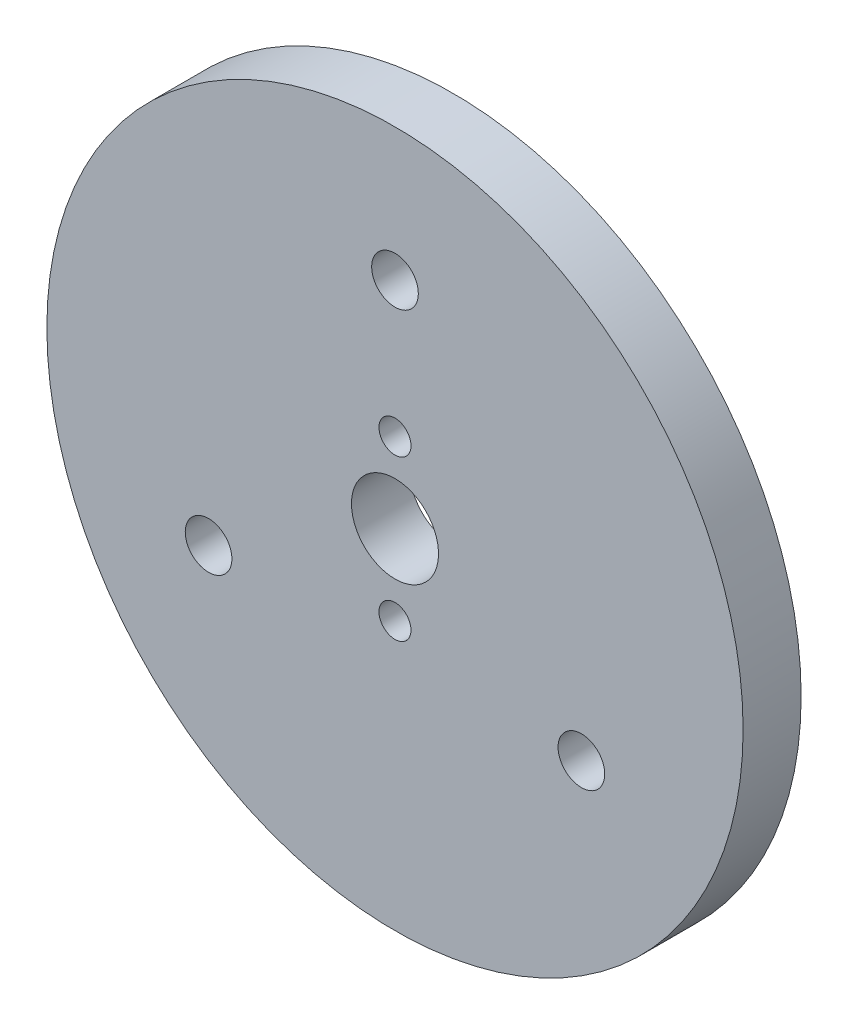
ISO-10303-21;
HEADER;
FILE_DESCRIPTION(('STEP AP214'),'2;1');
FILE_NAME('part.step','',(''),(''),'','','');
FILE_SCHEMA(('AUTOMOTIVE_DESIGN { 1 0 10303 214 1 1 1 1 }'));
ENDSEC;
DATA;
#1=APPLICATION_CONTEXT('core data for automotive mechanical design processes');
#2=APPLICATION_PROTOCOL_DEFINITION('international standard','automotive_design',2000,#1);
#3=PRODUCT_CONTEXT('',#1,'mechanical');
#4=PRODUCT('Part','Part','',(#3));
#5=PRODUCT_RELATED_PRODUCT_CATEGORY('part','',(#4));
#6=PRODUCT_DEFINITION_FORMATION('','',#4);
#7=PRODUCT_DEFINITION_CONTEXT('part definition',#1,'design');
#8=PRODUCT_DEFINITION('design','',#6,#7);
#9=PRODUCT_DEFINITION_SHAPE('','',#8);
#10=(LENGTH_UNIT() NAMED_UNIT(*) SI_UNIT(.MILLI.,.METRE.));
#11=(NAMED_UNIT(*) PLANE_ANGLE_UNIT() SI_UNIT($,.RADIAN.));
#12=(NAMED_UNIT(*) SI_UNIT($,.STERADIAN.) SOLID_ANGLE_UNIT());
#13=UNCERTAINTY_MEASURE_WITH_UNIT(LENGTH_MEASURE(1.E-05),#10,'distance_accuracy_value','');
#14=(GEOMETRIC_REPRESENTATION_CONTEXT(3) GLOBAL_UNCERTAINTY_ASSIGNED_CONTEXT((#13)) GLOBAL_UNIT_ASSIGNED_CONTEXT((#10,
#11,#12)) REPRESENTATION_CONTEXT('',''));
#15=CARTESIAN_POINT('',(0.,0.,0.));
#16=DIRECTION('',(0.,0.,1.));
#17=DIRECTION('',(1.,0.,0.));
#18=AXIS2_PLACEMENT_3D('',#15,#16,#17);
#19=CARTESIAN_POINT('',(0.,0.,0.));
#20=DIRECTION('',(0.,0.,1.));
#21=DIRECTION('',(1.,0.,0.));
#22=AXIS2_PLACEMENT_3D('',#19,#20,#21);
#23=PLANE('',#22);
#24=CARTESIAN_POINT('',(0.,23.5585,0.));
#25=DIRECTION('',(0.,0.,-1.));
#26=DIRECTION('',(-1.,0.,0.));
#27=AXIS2_PLACEMENT_3D('',#24,#25,#26);
#28=CIRCLE('',#27,2.5527);
#29=CARTESIAN_POINT('',(-2.5527,23.5585,0.));
#30=VERTEX_POINT('',#29);
#31=EDGE_CURVE('E78',#30,#30,#28,.T.);
#32=ORIENTED_EDGE('',*,*,#31,.F.);
#33=EDGE_LOOP('',(#32));
#34=FACE_BOUND('',#33,.T.);
#35=CARTESIAN_POINT('',(20.4022594750558,-11.7792499999998,0.));
#36=DIRECTION('',(0.,0.,-1.));
#37=DIRECTION('',(-1.,0.,0.));
#38=AXIS2_PLACEMENT_3D('',#35,#36,#37);
#39=CIRCLE('',#38,2.5527);
#40=CARTESIAN_POINT('',(17.8495594750558,-11.7792499999998,0.));
#41=VERTEX_POINT('',#40);
#42=EDGE_CURVE('E72',#41,#41,#39,.T.);
#43=ORIENTED_EDGE('',*,*,#42,.F.);
#44=EDGE_LOOP('',(#43));
#45=FACE_BOUND('',#44,.T.);
#46=CARTESIAN_POINT('',(0.,0.,0.));
#47=DIRECTION('',(0.,0.,1.));
#48=DIRECTION('',(1.,0.,0.));
#49=AXIS2_PLACEMENT_3D('',#46,#47,#48);
#50=CIRCLE('',#49,38.1);
#51=CARTESIAN_POINT('',(38.1,0.,0.));
#52=VERTEX_POINT('',#51);
#53=EDGE_CURVE('E37',#52,#52,#50,.T.);
#54=ORIENTED_EDGE('',*,*,#53,.F.);
#55=EDGE_LOOP('',(#54));
#56=FACE_BOUND('',#55,.T.);
#57=CARTESIAN_POINT('',(0.,0.,0.));
#58=DIRECTION('',(0.,0.,-1.));
#59=DIRECTION('',(-1.,0.,0.));
#60=AXIS2_PLACEMENT_3D('',#57,#58,#59);
#61=CIRCLE('',#60,4.7625);
#62=CARTESIAN_POINT('',(-4.7625,0.,0.));
#63=VERTEX_POINT('',#62);
#64=EDGE_CURVE('E46',#63,#63,#61,.T.);
#65=ORIENTED_EDGE('',*,*,#64,.F.);
#66=EDGE_LOOP('',(#65));
#67=FACE_BOUND('',#66,.T.);
#68=CARTESIAN_POINT('',(0.,8.7376,0.));
#69=DIRECTION('',(0.,0.,-1.));
#70=DIRECTION('',(-1.,0.,0.));
#71=AXIS2_PLACEMENT_3D('',#68,#69,#70);
#72=CIRCLE('',#71,1.7526);
#73=CARTESIAN_POINT('',(-1.7526,8.7376,0.));
#74=VERTEX_POINT('',#73);
#75=EDGE_CURVE('E52',#74,#74,#72,.T.);
#76=ORIENTED_EDGE('',*,*,#75,.F.);
#77=EDGE_LOOP('',(#76));
#78=FACE_BOUND('',#77,.T.);
#79=CARTESIAN_POINT('',(0.,-8.7376,0.));
#80=DIRECTION('',(0.,0.,-1.));
#81=DIRECTION('',(1.,0.,0.));
#82=AXIS2_PLACEMENT_3D('',#79,#80,#81);
#83=CIRCLE('',#82,1.7526);
#84=CARTESIAN_POINT('',(1.7526,-8.7376,0.));
#85=VERTEX_POINT('',#84);
#86=EDGE_CURVE('E58',#85,#85,#83,.T.);
#87=ORIENTED_EDGE('',*,*,#86,.F.);
#88=EDGE_LOOP('',(#87));
#89=FACE_BOUND('',#88,.T.);
#90=CARTESIAN_POINT('',(-20.4022594750556,-11.7792500000001,0.));
#91=DIRECTION('',(0.,0.,-1.));
#92=DIRECTION('',(-1.,0.,0.));
#93=AXIS2_PLACEMENT_3D('',#90,#91,#92);
#94=CIRCLE('',#93,2.5527);
#95=CARTESIAN_POINT('',(-22.9549594750556,-11.7792500000001,0.));
#96=VERTEX_POINT('',#95);
#97=EDGE_CURVE('E66',#96,#96,#94,.T.);
#98=ORIENTED_EDGE('',*,*,#97,.F.);
#99=EDGE_LOOP('',(#98));
#100=FACE_BOUND('',#99,.T.);
#101=ADVANCED_FACE('F33',(#34,#45,#56,#67,#78,#89,#100),#23,.F.);
#102=CARTESIAN_POINT('',(0.,0.,6.35));
#103=DIRECTION('',(0.,0.,-1.));
#104=DIRECTION('',(-1.,0.,0.));
#105=AXIS2_PLACEMENT_3D('',#102,#103,#104);
#106=CYLINDRICAL_SURFACE('',#105,38.1);
#107=CARTESIAN_POINT('',(0.,0.,6.35));
#108=DIRECTION('',(0.,0.,1.));
#109=DIRECTION('',(1.,0.,0.));
#110=AXIS2_PLACEMENT_3D('',#107,#108,#109);
#111=CIRCLE('',#110,38.1);
#112=CARTESIAN_POINT('',(38.1,0.,6.35));
#113=VERTEX_POINT('',#112);
#114=EDGE_CURVE('E10',#113,#113,#111,.T.);
#115=ORIENTED_EDGE('',*,*,#114,.F.);
#116=EDGE_LOOP('',(#115));
#117=FACE_BOUND('',#116,.T.);
#118=ORIENTED_EDGE('',*,*,#53,.T.);
#119=EDGE_LOOP('',(#118));
#120=FACE_BOUND('',#119,.T.);
#121=ADVANCED_FACE('F35',(#117,#120),#106,.T.);
#122=CARTESIAN_POINT('',(0.,0.,6.35));
#123=DIRECTION('',(0.,0.,1.));
#124=DIRECTION('',(1.,0.,0.));
#125=AXIS2_PLACEMENT_3D('',#122,#123,#124);
#126=PLANE('',#125);
#127=CARTESIAN_POINT('',(0.,23.5585,6.35));
#128=DIRECTION('',(0.,0.,1.));
#129=DIRECTION('',(1.,0.,0.));
#130=AXIS2_PLACEMENT_3D('',#127,#128,#129);
#131=CIRCLE('',#130,2.5527);
#132=CARTESIAN_POINT('',(2.5527,23.5585,6.35));
#133=VERTEX_POINT('',#132);
#134=EDGE_CURVE('E75',#133,#133,#131,.T.);
#135=ORIENTED_EDGE('',*,*,#134,.F.);
#136=EDGE_LOOP('',(#135));
#137=FACE_BOUND('',#136,.T.);
#138=CARTESIAN_POINT('',(20.4022594750558,-11.7792499999998,6.35));
#139=DIRECTION('',(0.,0.,1.));
#140=DIRECTION('',(1.,0.,0.));
#141=AXIS2_PLACEMENT_3D('',#138,#139,#140);
#142=CIRCLE('',#141,2.5527);
#143=CARTESIAN_POINT('',(22.9549594750558,-11.7792499999998,6.35));
#144=VERTEX_POINT('',#143);
#145=EDGE_CURVE('E69',#144,#144,#142,.T.);
#146=ORIENTED_EDGE('',*,*,#145,.F.);
#147=EDGE_LOOP('',(#146));
#148=FACE_BOUND('',#147,.T.);
#149=CARTESIAN_POINT('',(-20.4022594750556,-11.7792500000001,6.35));
#150=DIRECTION('',(0.,0.,1.));
#151=DIRECTION('',(1.,0.,0.));
#152=AXIS2_PLACEMENT_3D('',#149,#150,#151);
#153=CIRCLE('',#152,2.5527);
#154=CARTESIAN_POINT('',(-17.8495594750556,-11.7792500000001,6.35));
#155=VERTEX_POINT('',#154);
#156=EDGE_CURVE('E61',#155,#155,#153,.T.);
#157=ORIENTED_EDGE('',*,*,#156,.F.);
#158=EDGE_LOOP('',(#157));
#159=FACE_BOUND('',#158,.T.);
#160=CARTESIAN_POINT('',(0.,-8.7376,6.35));
#161=DIRECTION('',(0.,0.,-1.));
#162=DIRECTION('',(1.,0.,0.));
#163=AXIS2_PLACEMENT_3D('',#160,#161,#162);
#164=CIRCLE('',#163,1.7526);
#165=CARTESIAN_POINT('',(1.7526,-8.7376,6.35));
#166=VERTEX_POINT('',#165);
#167=EDGE_CURVE('E55',#166,#166,#164,.T.);
#168=ORIENTED_EDGE('',*,*,#167,.T.);
#169=EDGE_LOOP('',(#168));
#170=FACE_BOUND('',#169,.T.);
#171=CARTESIAN_POINT('',(0.,8.7376,6.35));
#172=DIRECTION('',(0.,0.,-1.));
#173=DIRECTION('',(-1.,0.,0.));
#174=AXIS2_PLACEMENT_3D('',#171,#172,#173);
#175=CIRCLE('',#174,1.7526);
#176=CARTESIAN_POINT('',(-1.7526,8.7376,6.35));
#177=VERTEX_POINT('',#176);
#178=EDGE_CURVE('E49',#177,#177,#175,.T.);
#179=ORIENTED_EDGE('',*,*,#178,.T.);
#180=EDGE_LOOP('',(#179));
#181=FACE_BOUND('',#180,.T.);
#182=CARTESIAN_POINT('',(0.,0.,6.35));
#183=DIRECTION('',(0.,0.,-1.));
#184=DIRECTION('',(-1.,0.,0.));
#185=AXIS2_PLACEMENT_3D('',#182,#183,#184);
#186=CIRCLE('',#185,4.7625);
#187=CARTESIAN_POINT('',(-4.7625,0.,6.35));
#188=VERTEX_POINT('',#187);
#189=EDGE_CURVE('E44',#188,#188,#186,.T.);
#190=ORIENTED_EDGE('',*,*,#189,.T.);
#191=EDGE_LOOP('',(#190));
#192=FACE_BOUND('',#191,.T.);
#193=ORIENTED_EDGE('',*,*,#114,.T.);
#194=EDGE_LOOP('',(#193));
#195=FACE_BOUND('',#194,.T.);
#196=ADVANCED_FACE('F121',(#137,#148,#159,#170,#181,#192,#195),#126,.T.);
#197=CARTESIAN_POINT('',(0.,0.,6.35));
#198=DIRECTION('',(0.,0.,-1.));
#199=DIRECTION('',(-1.,0.,0.));
#200=AXIS2_PLACEMENT_3D('',#197,#198,#199);
#201=CYLINDRICAL_SURFACE('',#200,4.7625);
#202=ORIENTED_EDGE('',*,*,#189,.F.);
#203=EDGE_LOOP('',(#202));
#204=FACE_BOUND('',#203,.T.);
#205=ORIENTED_EDGE('',*,*,#64,.T.);
#206=EDGE_LOOP('',(#205));
#207=FACE_BOUND('',#206,.T.);
#208=ADVANCED_FACE('F117',(#204,#207),#201,.F.);
#209=CARTESIAN_POINT('',(0.,8.7376,6.35));
#210=DIRECTION('',(0.,0.,-1.));
#211=DIRECTION('',(-1.,0.,0.));
#212=AXIS2_PLACEMENT_3D('',#209,#210,#211);
#213=CYLINDRICAL_SURFACE('',#212,1.7526);
#214=ORIENTED_EDGE('',*,*,#178,.F.);
#215=EDGE_LOOP('',(#214));
#216=FACE_BOUND('',#215,.T.);
#217=ORIENTED_EDGE('',*,*,#75,.T.);
#218=EDGE_LOOP('',(#217));
#219=FACE_BOUND('',#218,.T.);
#220=ADVANCED_FACE('F110',(#216,#219),#213,.F.);
#221=CARTESIAN_POINT('',(0.,-8.7376,6.35));
#222=DIRECTION('',(0.,0.,-1.));
#223=DIRECTION('',(-1.,0.,0.));
#224=AXIS2_PLACEMENT_3D('',#221,#222,#223);
#225=CYLINDRICAL_SURFACE('',#224,1.7526);
#226=ORIENTED_EDGE('',*,*,#167,.F.);
#227=EDGE_LOOP('',(#226));
#228=FACE_BOUND('',#227,.T.);
#229=ORIENTED_EDGE('',*,*,#86,.T.);
#230=EDGE_LOOP('',(#229));
#231=FACE_BOUND('',#230,.T.);
#232=ADVANCED_FACE('F101',(#228,#231),#225,.F.);
#233=CARTESIAN_POINT('',(-20.4022594750556,-11.7792500000001,0.));
#234=DIRECTION('',(0.,0.,-1.));
#235=DIRECTION('',(-1.,0.,0.));
#236=AXIS2_PLACEMENT_3D('',#233,#234,#235);
#237=CYLINDRICAL_SURFACE('',#236,2.5527);
#238=ORIENTED_EDGE('',*,*,#156,.T.);
#239=EDGE_LOOP('',(#238));
#240=FACE_BOUND('',#239,.T.);
#241=ORIENTED_EDGE('',*,*,#97,.T.);
#242=EDGE_LOOP('',(#241));
#243=FACE_BOUND('',#242,.T.);
#244=ADVANCED_FACE('F98',(#240,#243),#237,.F.);
#245=CARTESIAN_POINT('',(20.4022594750558,-11.7792499999998,0.));
#246=DIRECTION('',(0.,0.,-1.));
#247=DIRECTION('',(-1.,0.,0.));
#248=AXIS2_PLACEMENT_3D('',#245,#246,#247);
#249=CYLINDRICAL_SURFACE('',#248,2.5527);
#250=ORIENTED_EDGE('',*,*,#145,.T.);
#251=EDGE_LOOP('',(#250));
#252=FACE_BOUND('',#251,.T.);
#253=ORIENTED_EDGE('',*,*,#42,.T.);
#254=EDGE_LOOP('',(#253));
#255=FACE_BOUND('',#254,.T.);
#256=ADVANCED_FACE('F100',(#252,#255),#249,.F.);
#257=CARTESIAN_POINT('',(0.,23.5585,0.));
#258=DIRECTION('',(0.,0.,-1.));
#259=DIRECTION('',(-1.,0.,0.));
#260=AXIS2_PLACEMENT_3D('',#257,#258,#259);
#261=CYLINDRICAL_SURFACE('',#260,2.5527);
#262=ORIENTED_EDGE('',*,*,#134,.T.);
#263=EDGE_LOOP('',(#262));
#264=FACE_BOUND('',#263,.T.);
#265=ORIENTED_EDGE('',*,*,#31,.T.);
#266=EDGE_LOOP('',(#265));
#267=FACE_BOUND('',#266,.T.);
#268=ADVANCED_FACE('F82',(#264,#267),#261,.F.);
#269=CLOSED_SHELL('',(#101,#121,#196,#208,#220,#232,#244,#256,#268));
#270=MANIFOLD_SOLID_BREP('B2',#269);
#271=ADVANCED_BREP_SHAPE_REPRESENTATION('',(#18,#270),#14);
#272=SHAPE_DEFINITION_REPRESENTATION(#9,#271);
ENDSEC;
END-ISO-10303-21;
